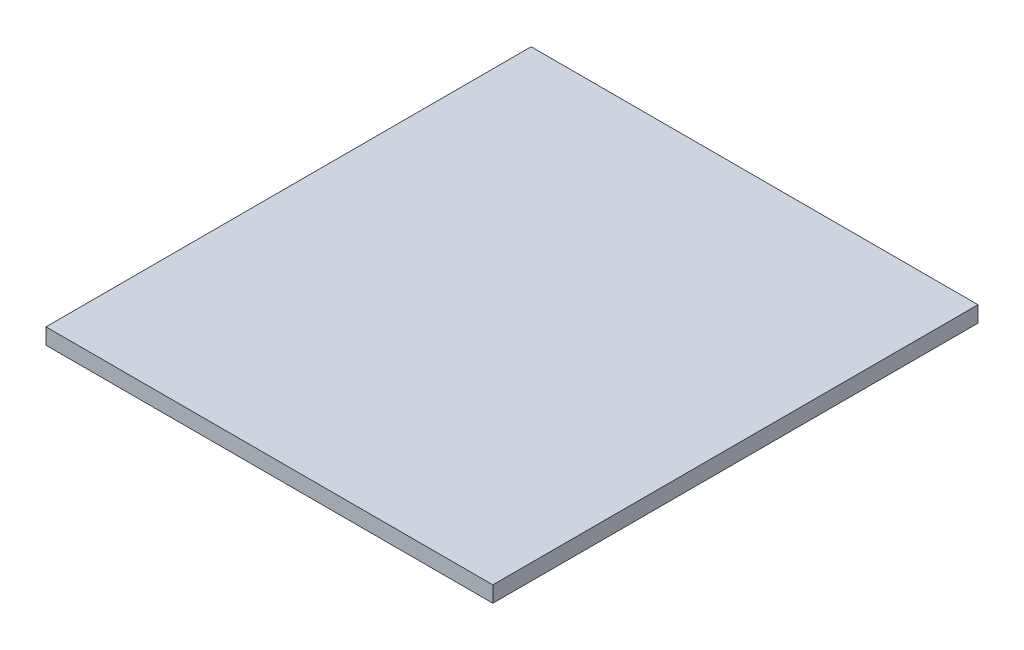
ISO-10303-21;
HEADER;
FILE_DESCRIPTION(('STEP AP214'),'2;1');
FILE_NAME('part.step','',(''),(''),'','','');
FILE_SCHEMA(('AUTOMOTIVE_DESIGN { 1 0 10303 214 1 1 1 1 }'));
ENDSEC;
DATA;
#1=APPLICATION_CONTEXT('core data for automotive mechanical design processes');
#2=APPLICATION_PROTOCOL_DEFINITION('international standard','automotive_design',2000,#1);
#3=PRODUCT_CONTEXT('',#1,'mechanical');
#4=PRODUCT('Part','Part','',(#3));
#5=PRODUCT_RELATED_PRODUCT_CATEGORY('part','',(#4));
#6=PRODUCT_DEFINITION_FORMATION('','',#4);
#7=PRODUCT_DEFINITION_CONTEXT('part definition',#1,'design');
#8=PRODUCT_DEFINITION('design','',#6,#7);
#9=PRODUCT_DEFINITION_SHAPE('','',#8);
#10=(LENGTH_UNIT() NAMED_UNIT(*) SI_UNIT(.MILLI.,.METRE.));
#11=(NAMED_UNIT(*) PLANE_ANGLE_UNIT() SI_UNIT($,.RADIAN.));
#12=(NAMED_UNIT(*) SI_UNIT($,.STERADIAN.) SOLID_ANGLE_UNIT());
#13=UNCERTAINTY_MEASURE_WITH_UNIT(LENGTH_MEASURE(1.E-05),#10,'distance_accuracy_value','');
#14=(GEOMETRIC_REPRESENTATION_CONTEXT(3) GLOBAL_UNCERTAINTY_ASSIGNED_CONTEXT((#13)) GLOBAL_UNIT_ASSIGNED_CONTEXT((#10,
#11,#12)) REPRESENTATION_CONTEXT('',''));
#15=CARTESIAN_POINT('',(0.,0.,0.));
#16=DIRECTION('',(0.,0.,1.));
#17=DIRECTION('',(1.,0.,0.));
#18=AXIS2_PLACEMENT_3D('',#15,#16,#17);
#19=CARTESIAN_POINT('',(-280.,20.,304.));
#20=DIRECTION('',(1.,0.,0.));
#21=DIRECTION('',(0.,0.,-1.));
#22=AXIS2_PLACEMENT_3D('',#19,#20,#21);
#23=PLANE('',#22);
#24=DIRECTION('',(0.,0.,1.));
#25=VECTOR('',#24,1.);
#26=CARTESIAN_POINT('',(-280.,0.,304.));
#27=LINE('',#26,#25);
#28=CARTESIAN_POINT('',(-280.,0.,-304.));
#29=VERTEX_POINT('',#28);
#30=CARTESIAN_POINT('',(-280.,0.,304.));
#31=VERTEX_POINT('',#30);
#32=EDGE_CURVE('E96',#29,#31,#27,.T.);
#33=ORIENTED_EDGE('',*,*,#32,.T.);
#34=DIRECTION('',(0.,-1.,0.));
#35=VECTOR('',#34,1.);
#36=CARTESIAN_POINT('',(-280.,20.,304.));
#37=LINE('',#36,#35);
#38=CARTESIAN_POINT('',(-280.,20.,304.));
#39=VERTEX_POINT('',#38);
#40=EDGE_CURVE('E11',#39,#31,#37,.T.);
#41=ORIENTED_EDGE('',*,*,#40,.F.);
#42=DIRECTION('',(0.,0.,1.));
#43=VECTOR('',#42,1.);
#44=CARTESIAN_POINT('',(-280.,20.,304.));
#45=LINE('',#44,#43);
#46=CARTESIAN_POINT('',(-280.,20.,-304.));
#47=VERTEX_POINT('',#46);
#48=EDGE_CURVE('E84',#47,#39,#45,.T.);
#49=ORIENTED_EDGE('',*,*,#48,.F.);
#50=DIRECTION('',(0.,-1.,0.));
#51=VECTOR('',#50,1.);
#52=CARTESIAN_POINT('',(-280.,20.,-304.));
#53=LINE('',#52,#51);
#54=EDGE_CURVE('E92',#47,#29,#53,.T.);
#55=ORIENTED_EDGE('',*,*,#54,.T.);
#56=EDGE_LOOP('',(#33,#41,#49,#55));
#57=FACE_BOUND('',#56,.T.);
#58=ADVANCED_FACE('F33',(#57),#23,.F.);
#59=CARTESIAN_POINT('',(280.,20.,304.));
#60=DIRECTION('',(0.,0.,-1.));
#61=DIRECTION('',(-1.,0.,0.));
#62=AXIS2_PLACEMENT_3D('',#59,#60,#61);
#63=PLANE('',#62);
#64=DIRECTION('',(1.,0.,0.));
#65=VECTOR('',#64,1.);
#66=CARTESIAN_POINT('',(280.,0.,304.));
#67=LINE('',#66,#65);
#68=CARTESIAN_POINT('',(280.,0.,304.));
#69=VERTEX_POINT('',#68);
#70=EDGE_CURVE('E88',#31,#69,#67,.T.);
#71=ORIENTED_EDGE('',*,*,#70,.T.);
#72=DIRECTION('',(0.,-1.,0.));
#73=VECTOR('',#72,1.);
#74=CARTESIAN_POINT('',(280.,20.,304.));
#75=LINE('',#74,#73);
#76=CARTESIAN_POINT('',(280.,20.,304.));
#77=VERTEX_POINT('',#76);
#78=EDGE_CURVE('E41',#77,#69,#75,.T.);
#79=ORIENTED_EDGE('',*,*,#78,.F.);
#80=DIRECTION('',(1.,0.,0.));
#81=VECTOR('',#80,1.);
#82=CARTESIAN_POINT('',(280.,20.,304.));
#83=LINE('',#82,#81);
#84=EDGE_CURVE('E79',#39,#77,#83,.T.);
#85=ORIENTED_EDGE('',*,*,#84,.F.);
#86=ORIENTED_EDGE('',*,*,#40,.T.);
#87=EDGE_LOOP('',(#71,#79,#85,#86));
#88=FACE_BOUND('',#87,.T.);
#89=ADVANCED_FACE('F87',(#88),#63,.F.);
#90=CARTESIAN_POINT('',(280.,20.,304.));
#91=DIRECTION('',(-1.,0.,0.));
#92=DIRECTION('',(0.,0.,1.));
#93=AXIS2_PLACEMENT_3D('',#90,#91,#92);
#94=PLANE('',#93);
#95=DIRECTION('',(0.,0.,-1.));
#96=VECTOR('',#95,1.);
#97=CARTESIAN_POINT('',(280.,0.,304.));
#98=LINE('',#97,#96);
#99=CARTESIAN_POINT('',(280.,0.,-304.));
#100=VERTEX_POINT('',#99);
#101=EDGE_CURVE('E66',#69,#100,#98,.T.);
#102=ORIENTED_EDGE('',*,*,#101,.T.);
#103=DIRECTION('',(0.,-1.,0.));
#104=VECTOR('',#103,1.);
#105=CARTESIAN_POINT('',(280.,20.,-304.));
#106=LINE('',#105,#104);
#107=CARTESIAN_POINT('',(280.,20.,-304.));
#108=VERTEX_POINT('',#107);
#109=EDGE_CURVE('E89',#108,#100,#106,.T.);
#110=ORIENTED_EDGE('',*,*,#109,.F.);
#111=DIRECTION('',(0.,0.,-1.));
#112=VECTOR('',#111,1.);
#113=CARTESIAN_POINT('',(280.,20.,304.));
#114=LINE('',#113,#112);
#115=EDGE_CURVE('E82',#77,#108,#114,.T.);
#116=ORIENTED_EDGE('',*,*,#115,.F.);
#117=ORIENTED_EDGE('',*,*,#78,.T.);
#118=EDGE_LOOP('',(#102,#110,#116,#117));
#119=FACE_BOUND('',#118,.T.);
#120=ADVANCED_FACE('F90',(#119),#94,.F.);
#121=CARTESIAN_POINT('',(280.,20.,-304.));
#122=DIRECTION('',(0.,0.,1.));
#123=DIRECTION('',(1.,0.,0.));
#124=AXIS2_PLACEMENT_3D('',#121,#122,#123);
#125=PLANE('',#124);
#126=DIRECTION('',(-1.,0.,0.));
#127=VECTOR('',#126,1.);
#128=CARTESIAN_POINT('',(280.,0.,-304.));
#129=LINE('',#128,#127);
#130=EDGE_CURVE('E72',#100,#29,#129,.T.);
#131=ORIENTED_EDGE('',*,*,#130,.T.);
#132=ORIENTED_EDGE('',*,*,#54,.F.);
#133=DIRECTION('',(-1.,0.,0.));
#134=VECTOR('',#133,1.);
#135=CARTESIAN_POINT('',(280.,20.,-304.));
#136=LINE('',#135,#134);
#137=EDGE_CURVE('E49',#108,#47,#136,.T.);
#138=ORIENTED_EDGE('',*,*,#137,.F.);
#139=ORIENTED_EDGE('',*,*,#109,.T.);
#140=EDGE_LOOP('',(#131,#132,#138,#139));
#141=FACE_BOUND('',#140,.T.);
#142=ADVANCED_FACE('F103',(#141),#125,.F.);
#143=CARTESIAN_POINT('',(0.,20.,0.));
#144=DIRECTION('',(0.,1.,0.));
#145=DIRECTION('',(0.,0.,1.));
#146=AXIS2_PLACEMENT_3D('',#143,#144,#145);
#147=PLANE('',#146);
#148=ORIENTED_EDGE('',*,*,#48,.T.);
#149=ORIENTED_EDGE('',*,*,#84,.T.);
#150=ORIENTED_EDGE('',*,*,#115,.T.);
#151=ORIENTED_EDGE('',*,*,#137,.T.);
#152=EDGE_LOOP('',(#148,#149,#150,#151));
#153=FACE_BOUND('',#152,.T.);
#154=ADVANCED_FACE('F80',(#153),#147,.T.);
#155=CARTESIAN_POINT('',(0.,0.,0.));
#156=DIRECTION('',(0.,1.,0.));
#157=DIRECTION('',(0.,0.,1.));
#158=AXIS2_PLACEMENT_3D('',#155,#156,#157);
#159=PLANE('',#158);
#160=ORIENTED_EDGE('',*,*,#32,.F.);
#161=ORIENTED_EDGE('',*,*,#130,.F.);
#162=ORIENTED_EDGE('',*,*,#101,.F.);
#163=ORIENTED_EDGE('',*,*,#70,.F.);
#164=EDGE_LOOP('',(#160,#161,#162,#163));
#165=FACE_BOUND('',#164,.T.);
#166=ADVANCED_FACE('F106',(#165),#159,.F.);
#167=CLOSED_SHELL('',(#58,#89,#120,#142,#154,#166));
#168=MANIFOLD_SOLID_BREP('B2',#167);
#169=ADVANCED_BREP_SHAPE_REPRESENTATION('',(#18,#168),#14);
#170=SHAPE_DEFINITION_REPRESENTATION(#9,#169);
ENDSEC;
END-ISO-10303-21;
